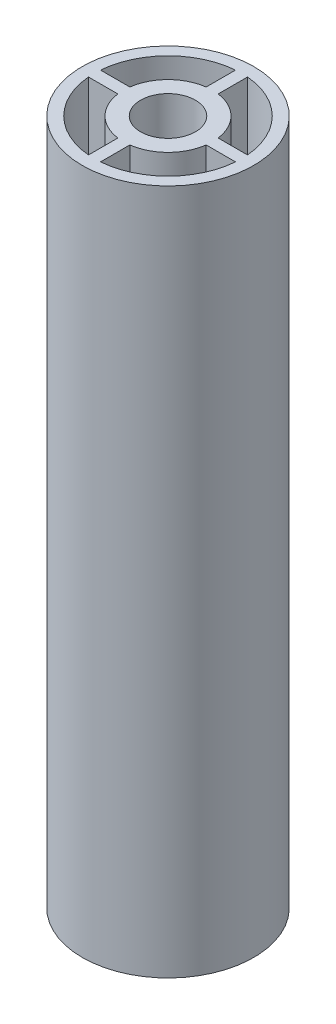
ISO-10303-21;
HEADER;
FILE_DESCRIPTION(('STEP AP214'),'2;1');
FILE_NAME('part.step','',(''),(''),'','','');
FILE_SCHEMA(('AUTOMOTIVE_DESIGN { 1 0 10303 214 1 1 1 1 }'));
ENDSEC;
DATA;
#1=APPLICATION_CONTEXT('core data for automotive mechanical design processes');
#2=APPLICATION_PROTOCOL_DEFINITION('international standard','automotive_design',2000,#1);
#3=PRODUCT_CONTEXT('',#1,'mechanical');
#4=PRODUCT('Part','Part','',(#3));
#5=PRODUCT_RELATED_PRODUCT_CATEGORY('part','',(#4));
#6=PRODUCT_DEFINITION_FORMATION('','',#4);
#7=PRODUCT_DEFINITION_CONTEXT('part definition',#1,'design');
#8=PRODUCT_DEFINITION('design','',#6,#7);
#9=PRODUCT_DEFINITION_SHAPE('','',#8);
#10=(LENGTH_UNIT() NAMED_UNIT(*) SI_UNIT(.MILLI.,.METRE.));
#11=(NAMED_UNIT(*) PLANE_ANGLE_UNIT() SI_UNIT($,.RADIAN.));
#12=(NAMED_UNIT(*) SI_UNIT($,.STERADIAN.) SOLID_ANGLE_UNIT());
#13=UNCERTAINTY_MEASURE_WITH_UNIT(LENGTH_MEASURE(1.E-05),#10,'distance_accuracy_value','');
#14=(GEOMETRIC_REPRESENTATION_CONTEXT(3) GLOBAL_UNCERTAINTY_ASSIGNED_CONTEXT((#13)) GLOBAL_UNIT_ASSIGNED_CONTEXT((#10,
#11,#12)) REPRESENTATION_CONTEXT('',''));
#15=CARTESIAN_POINT('',(0.,0.,0.));
#16=DIRECTION('',(0.,0.,1.));
#17=DIRECTION('',(1.,0.,0.));
#18=AXIS2_PLACEMENT_3D('',#15,#16,#17);
#19=CARTESIAN_POINT('',(0.,40.,0.));
#20=DIRECTION('',(0.,-1.,0.));
#21=DIRECTION('',(0.,0.,-1.));
#22=AXIS2_PLACEMENT_3D('',#19,#20,#21);
#23=CYLINDRICAL_SURFACE('',#22,4.3);
#24=CARTESIAN_POINT('',(0.,0.,0.));
#25=DIRECTION('',(0.,1.,0.));
#26=DIRECTION('',(0.,0.,1.));
#27=AXIS2_PLACEMENT_3D('',#24,#25,#26);
#28=CIRCLE('',#27,4.3);
#29=CARTESIAN_POINT('',(-0.350000000000001,0.,-4.28573214281994));
#30=VERTEX_POINT('',#29);
#31=CARTESIAN_POINT('',(-4.28573214281994,0.,-0.35));
#32=VERTEX_POINT('',#31);
#33=EDGE_CURVE('E226',#30,#32,#28,.T.);
#34=ORIENTED_EDGE('',*,*,#33,.F.);
#35=DIRECTION('',(0.,-1.,0.));
#36=VECTOR('',#35,1.);
#37=CARTESIAN_POINT('',(-0.350000000000001,40.,-4.28573214281994));
#38=LINE('',#37,#36);
#39=CARTESIAN_POINT('',(-0.350000000000001,40.,-4.28573214281994));
#40=VERTEX_POINT('',#39);
#41=EDGE_CURVE('E11',#40,#30,#38,.T.);
#42=ORIENTED_EDGE('',*,*,#41,.F.);
#43=CARTESIAN_POINT('',(0.,40.,0.));
#44=DIRECTION('',(0.,1.,0.));
#45=DIRECTION('',(0.,0.,1.));
#46=AXIS2_PLACEMENT_3D('',#43,#44,#45);
#47=CIRCLE('',#46,4.3);
#48=CARTESIAN_POINT('',(-4.28573214281994,40.,-0.35));
#49=VERTEX_POINT('',#48);
#50=EDGE_CURVE('E176',#40,#49,#47,.T.);
#51=ORIENTED_EDGE('',*,*,#50,.T.);
#52=DIRECTION('',(0.,-1.,0.));
#53=VECTOR('',#52,1.);
#54=CARTESIAN_POINT('',(-4.28573214281994,40.,-0.35));
#55=LINE('',#54,#53);
#56=EDGE_CURVE('E56',#49,#32,#55,.T.);
#57=ORIENTED_EDGE('',*,*,#56,.T.);
#58=EDGE_LOOP('',(#34,#42,#51,#57));
#59=FACE_BOUND('',#58,.T.);
#60=ADVANCED_FACE('F37',(#59),#23,.F.);
#61=CARTESIAN_POINT('',(-0.349999999999999,40.,0.));
#62=DIRECTION('',(-1.,0.,0.));
#63=DIRECTION('',(0.,0.,1.));
#64=AXIS2_PLACEMENT_3D('',#61,#62,#63);
#65=PLANE('',#64);
#66=DIRECTION('',(0.,0.,-1.));
#67=VECTOR('',#66,1.);
#68=CARTESIAN_POINT('',(-0.349999999999999,0.,0.));
#69=LINE('',#68,#67);
#70=CARTESIAN_POINT('',(-0.35,0.,-2.57633460559765));
#71=VERTEX_POINT('',#70);
#72=EDGE_CURVE('E163',#71,#30,#69,.T.);
#73=ORIENTED_EDGE('',*,*,#72,.F.);
#74=DIRECTION('',(0.,-1.,0.));
#75=VECTOR('',#74,1.);
#76=CARTESIAN_POINT('',(-0.35,40.,-2.57633460559765));
#77=LINE('',#76,#75);
#78=CARTESIAN_POINT('',(-0.35,40.,-2.57633460559765));
#79=VERTEX_POINT('',#78);
#80=EDGE_CURVE('E47',#79,#71,#77,.T.);
#81=ORIENTED_EDGE('',*,*,#80,.F.);
#82=DIRECTION('',(0.,0.,-1.));
#83=VECTOR('',#82,1.);
#84=CARTESIAN_POINT('',(-0.349999999999999,40.,0.));
#85=LINE('',#84,#83);
#86=EDGE_CURVE('E161',#79,#40,#85,.T.);
#87=ORIENTED_EDGE('',*,*,#86,.T.);
#88=ORIENTED_EDGE('',*,*,#41,.T.);
#89=EDGE_LOOP('',(#73,#81,#87,#88));
#90=FACE_BOUND('',#89,.T.);
#91=ADVANCED_FACE('F159',(#90),#65,.T.);
#92=CARTESIAN_POINT('',(0.,40.,0.));
#93=DIRECTION('',(0.,-1.,0.));
#94=DIRECTION('',(0.,0.,-1.));
#95=AXIS2_PLACEMENT_3D('',#92,#93,#94);
#96=CYLINDRICAL_SURFACE('',#95,2.6);
#97=CARTESIAN_POINT('',(0.,0.,0.));
#98=DIRECTION('',(0.,1.,0.));
#99=DIRECTION('',(0.,0.,1.));
#100=AXIS2_PLACEMENT_3D('',#97,#98,#99);
#101=CIRCLE('',#100,2.6);
#102=CARTESIAN_POINT('',(-2.57633460559765,0.,-0.35));
#103=VERTEX_POINT('',#102);
#104=EDGE_CURVE('E229',#71,#103,#101,.T.);
#105=ORIENTED_EDGE('',*,*,#104,.T.);
#106=DIRECTION('',(0.,-1.,0.));
#107=VECTOR('',#106,1.);
#108=CARTESIAN_POINT('',(-2.57633460559765,40.,-0.35));
#109=LINE('',#108,#107);
#110=CARTESIAN_POINT('',(-2.57633460559765,40.,-0.35));
#111=VERTEX_POINT('',#110);
#112=EDGE_CURVE('E106',#111,#103,#109,.T.);
#113=ORIENTED_EDGE('',*,*,#112,.F.);
#114=CARTESIAN_POINT('',(0.,40.,0.));
#115=DIRECTION('',(0.,1.,0.));
#116=DIRECTION('',(0.,0.,1.));
#117=AXIS2_PLACEMENT_3D('',#114,#115,#116);
#118=CIRCLE('',#117,2.6);
#119=EDGE_CURVE('E167',#79,#111,#118,.T.);
#120=ORIENTED_EDGE('',*,*,#119,.F.);
#121=ORIENTED_EDGE('',*,*,#80,.T.);
#122=EDGE_LOOP('',(#105,#113,#120,#121));
#123=FACE_BOUND('',#122,.T.);
#124=ADVANCED_FACE('F168',(#123),#96,.T.);
#125=CARTESIAN_POINT('',(0.,40.,0.));
#126=DIRECTION('',(0.,-1.,0.));
#127=DIRECTION('',(0.,0.,-1.));
#128=AXIS2_PLACEMENT_3D('',#125,#126,#127);
#129=CYLINDRICAL_SURFACE('',#128,4.3);
#130=CARTESIAN_POINT('',(0.,0.,0.));
#131=DIRECTION('',(0.,1.,0.));
#132=DIRECTION('',(0.,0.,1.));
#133=AXIS2_PLACEMENT_3D('',#130,#131,#132);
#134=CIRCLE('',#133,4.3);
#135=CARTESIAN_POINT('',(-4.28573214281994,0.,0.35));
#136=VERTEX_POINT('',#135);
#137=CARTESIAN_POINT('',(-0.35,0.,4.28573214281994));
#138=VERTEX_POINT('',#137);
#139=EDGE_CURVE('E214',#136,#138,#134,.T.);
#140=ORIENTED_EDGE('',*,*,#139,.F.);
#141=DIRECTION('',(0.,-1.,0.));
#142=VECTOR('',#141,1.);
#143=CARTESIAN_POINT('',(-4.28573214281994,40.,0.35));
#144=LINE('',#143,#142);
#145=CARTESIAN_POINT('',(-4.28573214281994,40.,0.35));
#146=VERTEX_POINT('',#145);
#147=EDGE_CURVE('E242',#146,#136,#144,.T.);
#148=ORIENTED_EDGE('',*,*,#147,.F.);
#149=CARTESIAN_POINT('',(0.,40.,0.));
#150=DIRECTION('',(0.,1.,0.));
#151=DIRECTION('',(0.,0.,1.));
#152=AXIS2_PLACEMENT_3D('',#149,#150,#151);
#153=CIRCLE('',#152,4.3);
#154=CARTESIAN_POINT('',(-0.35,40.,4.28573214281994));
#155=VERTEX_POINT('',#154);
#156=EDGE_CURVE('E299',#146,#155,#153,.T.);
#157=ORIENTED_EDGE('',*,*,#156,.T.);
#158=DIRECTION('',(0.,-1.,0.));
#159=VECTOR('',#158,1.);
#160=CARTESIAN_POINT('',(-0.35,40.,4.28573214281994));
#161=LINE('',#160,#159);
#162=EDGE_CURVE('E244',#155,#138,#161,.T.);
#163=ORIENTED_EDGE('',*,*,#162,.T.);
#164=EDGE_LOOP('',(#140,#148,#157,#163));
#165=FACE_BOUND('',#164,.T.);
#166=ADVANCED_FACE('F324',(#165),#129,.F.);
#167=CARTESIAN_POINT('',(0.,40.,0.349999999999999));
#168=DIRECTION('',(0.,0.,1.));
#169=DIRECTION('',(1.,0.,0.));
#170=AXIS2_PLACEMENT_3D('',#167,#168,#169);
#171=PLANE('',#170);
#172=DIRECTION('',(-1.,0.,0.));
#173=VECTOR('',#172,1.);
#174=CARTESIAN_POINT('',(0.,0.,0.349999999999999));
#175=LINE('',#174,#173);
#176=CARTESIAN_POINT('',(-2.57633460559765,0.,0.35));
#177=VERTEX_POINT('',#176);
#178=EDGE_CURVE('E217',#177,#136,#175,.T.);
#179=ORIENTED_EDGE('',*,*,#178,.F.);
#180=DIRECTION('',(0.,-1.,0.));
#181=VECTOR('',#180,1.);
#182=CARTESIAN_POINT('',(-2.57633460559765,40.,0.35));
#183=LINE('',#182,#181);
#184=CARTESIAN_POINT('',(-2.57633460559765,40.,0.35));
#185=VERTEX_POINT('',#184);
#186=EDGE_CURVE('E249',#185,#177,#183,.T.);
#187=ORIENTED_EDGE('',*,*,#186,.F.);
#188=DIRECTION('',(-1.,0.,0.));
#189=VECTOR('',#188,1.);
#190=CARTESIAN_POINT('',(0.,40.,0.349999999999999));
#191=LINE('',#190,#189);
#192=EDGE_CURVE('E302',#185,#146,#191,.T.);
#193=ORIENTED_EDGE('',*,*,#192,.T.);
#194=ORIENTED_EDGE('',*,*,#147,.T.);
#195=EDGE_LOOP('',(#179,#187,#193,#194));
#196=FACE_BOUND('',#195,.T.);
#197=ADVANCED_FACE('F326',(#196),#171,.T.);
#198=CARTESIAN_POINT('',(0.,40.,0.));
#199=DIRECTION('',(0.,-1.,0.));
#200=DIRECTION('',(0.,0.,-1.));
#201=AXIS2_PLACEMENT_3D('',#198,#199,#200);
#202=CYLINDRICAL_SURFACE('',#201,2.6);
#203=CARTESIAN_POINT('',(0.,0.,0.));
#204=DIRECTION('',(0.,1.,0.));
#205=DIRECTION('',(0.,0.,1.));
#206=AXIS2_PLACEMENT_3D('',#203,#204,#205);
#207=CIRCLE('',#206,2.6);
#208=CARTESIAN_POINT('',(-0.349999999999999,0.,2.57633460559765));
#209=VERTEX_POINT('',#208);
#210=EDGE_CURVE('E220',#177,#209,#207,.T.);
#211=ORIENTED_EDGE('',*,*,#210,.T.);
#212=DIRECTION('',(0.,-1.,0.));
#213=VECTOR('',#212,1.);
#214=CARTESIAN_POINT('',(-0.349999999999999,40.,2.57633460559765));
#215=LINE('',#214,#213);
#216=CARTESIAN_POINT('',(-0.349999999999999,40.,2.57633460559765));
#217=VERTEX_POINT('',#216);
#218=EDGE_CURVE('E246',#217,#209,#215,.T.);
#219=ORIENTED_EDGE('',*,*,#218,.F.);
#220=CARTESIAN_POINT('',(0.,40.,0.));
#221=DIRECTION('',(0.,1.,0.));
#222=DIRECTION('',(0.,0.,1.));
#223=AXIS2_PLACEMENT_3D('',#220,#221,#222);
#224=CIRCLE('',#223,2.6);
#225=EDGE_CURVE('E305',#185,#217,#224,.T.);
#226=ORIENTED_EDGE('',*,*,#225,.F.);
#227=ORIENTED_EDGE('',*,*,#186,.T.);
#228=EDGE_LOOP('',(#211,#219,#226,#227));
#229=FACE_BOUND('',#228,.T.);
#230=ADVANCED_FACE('F317',(#229),#202,.T.);
#231=CARTESIAN_POINT('',(0.,40.,0.));
#232=DIRECTION('',(0.,-1.,0.));
#233=DIRECTION('',(0.,0.,-1.));
#234=AXIS2_PLACEMENT_3D('',#231,#232,#233);
#235=CYLINDRICAL_SURFACE('',#234,4.3);
#236=CARTESIAN_POINT('',(0.,0.,0.));
#237=DIRECTION('',(0.,1.,0.));
#238=DIRECTION('',(0.,0.,1.));
#239=AXIS2_PLACEMENT_3D('',#236,#237,#238);
#240=CIRCLE('',#239,4.3);
#241=CARTESIAN_POINT('',(0.35,0.,4.28573214281994));
#242=VERTEX_POINT('',#241);
#243=CARTESIAN_POINT('',(4.28573214281994,0.,0.35));
#244=VERTEX_POINT('',#243);
#245=EDGE_CURVE('E202',#242,#244,#240,.T.);
#246=ORIENTED_EDGE('',*,*,#245,.F.);
#247=DIRECTION('',(0.,-1.,0.));
#248=VECTOR('',#247,1.);
#249=CARTESIAN_POINT('',(0.35,40.,4.28573214281994));
#250=LINE('',#249,#248);
#251=CARTESIAN_POINT('',(0.35,40.,4.28573214281994));
#252=VERTEX_POINT('',#251);
#253=EDGE_CURVE('E247',#252,#242,#250,.T.);
#254=ORIENTED_EDGE('',*,*,#253,.F.);
#255=CARTESIAN_POINT('',(0.,40.,0.));
#256=DIRECTION('',(0.,1.,0.));
#257=DIRECTION('',(0.,0.,1.));
#258=AXIS2_PLACEMENT_3D('',#255,#256,#257);
#259=CIRCLE('',#258,4.3);
#260=CARTESIAN_POINT('',(4.28573214281994,40.,0.35));
#261=VERTEX_POINT('',#260);
#262=EDGE_CURVE('E284',#252,#261,#259,.T.);
#263=ORIENTED_EDGE('',*,*,#262,.T.);
#264=DIRECTION('',(0.,-1.,0.));
#265=VECTOR('',#264,1.);
#266=CARTESIAN_POINT('',(4.28573214281994,40.,0.35));
#267=LINE('',#266,#265);
#268=EDGE_CURVE('E252',#261,#244,#267,.T.);
#269=ORIENTED_EDGE('',*,*,#268,.T.);
#270=EDGE_LOOP('',(#246,#254,#263,#269));
#271=FACE_BOUND('',#270,.T.);
#272=ADVANCED_FACE('F333',(#271),#235,.F.);
#273=CARTESIAN_POINT('',(0.349999999999999,40.,0.));
#274=DIRECTION('',(1.,0.,0.));
#275=DIRECTION('',(0.,0.,-1.));
#276=AXIS2_PLACEMENT_3D('',#273,#274,#275);
#277=PLANE('',#276);
#278=DIRECTION('',(0.,0.,1.));
#279=VECTOR('',#278,1.);
#280=CARTESIAN_POINT('',(0.349999999999999,0.,0.));
#281=LINE('',#280,#279);
#282=CARTESIAN_POINT('',(0.35,0.,2.57633460559765));
#283=VERTEX_POINT('',#282);
#284=EDGE_CURVE('E205',#283,#242,#281,.T.);
#285=ORIENTED_EDGE('',*,*,#284,.F.);
#286=DIRECTION('',(0.,-1.,0.));
#287=VECTOR('',#286,1.);
#288=CARTESIAN_POINT('',(0.35,40.,2.57633460559765));
#289=LINE('',#288,#287);
#290=CARTESIAN_POINT('',(0.35,40.,2.57633460559765));
#291=VERTEX_POINT('',#290);
#292=EDGE_CURVE('E256',#291,#283,#289,.T.);
#293=ORIENTED_EDGE('',*,*,#292,.F.);
#294=DIRECTION('',(0.,0.,1.));
#295=VECTOR('',#294,1.);
#296=CARTESIAN_POINT('',(0.349999999999999,40.,0.));
#297=LINE('',#296,#295);
#298=EDGE_CURVE('E287',#291,#252,#297,.T.);
#299=ORIENTED_EDGE('',*,*,#298,.T.);
#300=ORIENTED_EDGE('',*,*,#253,.T.);
#301=EDGE_LOOP('',(#285,#293,#299,#300));
#302=FACE_BOUND('',#301,.T.);
#303=ADVANCED_FACE('F389',(#302),#277,.T.);
#304=CARTESIAN_POINT('',(0.,40.,0.));
#305=DIRECTION('',(0.,-1.,0.));
#306=DIRECTION('',(0.,0.,-1.));
#307=AXIS2_PLACEMENT_3D('',#304,#305,#306);
#308=CYLINDRICAL_SURFACE('',#307,2.6);
#309=CARTESIAN_POINT('',(0.,0.,0.));
#310=DIRECTION('',(0.,1.,0.));
#311=DIRECTION('',(0.,0.,1.));
#312=AXIS2_PLACEMENT_3D('',#309,#310,#311);
#313=CIRCLE('',#312,2.6);
#314=CARTESIAN_POINT('',(2.57633460559765,0.,0.35));
#315=VERTEX_POINT('',#314);
#316=EDGE_CURVE('E208',#283,#315,#313,.T.);
#317=ORIENTED_EDGE('',*,*,#316,.T.);
#318=DIRECTION('',(0.,-1.,0.));
#319=VECTOR('',#318,1.);
#320=CARTESIAN_POINT('',(2.57633460559765,40.,0.35));
#321=LINE('',#320,#319);
#322=CARTESIAN_POINT('',(2.57633460559765,40.,0.35));
#323=VERTEX_POINT('',#322);
#324=EDGE_CURVE('E254',#323,#315,#321,.T.);
#325=ORIENTED_EDGE('',*,*,#324,.F.);
#326=CARTESIAN_POINT('',(0.,40.,0.));
#327=DIRECTION('',(0.,1.,0.));
#328=DIRECTION('',(0.,0.,1.));
#329=AXIS2_PLACEMENT_3D('',#326,#327,#328);
#330=CIRCLE('',#329,2.6);
#331=EDGE_CURVE('E294',#291,#323,#330,.T.);
#332=ORIENTED_EDGE('',*,*,#331,.F.);
#333=ORIENTED_EDGE('',*,*,#292,.T.);
#334=EDGE_LOOP('',(#317,#325,#332,#333));
#335=FACE_BOUND('',#334,.T.);
#336=ADVANCED_FACE('F399',(#335),#308,.T.);
#337=CARTESIAN_POINT('',(0.,40.,0.));
#338=DIRECTION('',(0.,-1.,0.));
#339=DIRECTION('',(0.,0.,-1.));
#340=AXIS2_PLACEMENT_3D('',#337,#338,#339);
#341=CYLINDRICAL_SURFACE('',#340,4.3);
#342=CARTESIAN_POINT('',(0.,0.,0.));
#343=DIRECTION('',(0.,1.,0.));
#344=DIRECTION('',(0.,0.,1.));
#345=AXIS2_PLACEMENT_3D('',#342,#343,#344);
#346=CIRCLE('',#345,4.3);
#347=CARTESIAN_POINT('',(4.28573214281994,0.,-0.35));
#348=VERTEX_POINT('',#347);
#349=CARTESIAN_POINT('',(0.349999999999999,0.,-4.28573214281994));
#350=VERTEX_POINT('',#349);
#351=EDGE_CURVE('E190',#348,#350,#346,.T.);
#352=ORIENTED_EDGE('',*,*,#351,.F.);
#353=DIRECTION('',(0.,-1.,0.));
#354=VECTOR('',#353,1.);
#355=CARTESIAN_POINT('',(4.28573214281994,40.,-0.35));
#356=LINE('',#355,#354);
#357=CARTESIAN_POINT('',(4.28573214281994,40.,-0.35));
#358=VERTEX_POINT('',#357);
#359=EDGE_CURVE('E41',#358,#348,#356,.T.);
#360=ORIENTED_EDGE('',*,*,#359,.F.);
#361=CARTESIAN_POINT('',(0.,40.,0.));
#362=DIRECTION('',(0.,1.,0.));
#363=DIRECTION('',(0.,0.,1.));
#364=AXIS2_PLACEMENT_3D('',#361,#362,#363);
#365=CIRCLE('',#364,4.3);
#366=CARTESIAN_POINT('',(0.349999999999999,40.,-4.28573214281994));
#367=VERTEX_POINT('',#366);
#368=EDGE_CURVE('E240',#358,#367,#365,.T.);
#369=ORIENTED_EDGE('',*,*,#368,.T.);
#370=DIRECTION('',(0.,-1.,0.));
#371=VECTOR('',#370,1.);
#372=CARTESIAN_POINT('',(0.349999999999999,40.,-4.28573214281994));
#373=LINE('',#372,#371);
#374=EDGE_CURVE('E189',#367,#350,#373,.T.);
#375=ORIENTED_EDGE('',*,*,#374,.T.);
#376=EDGE_LOOP('',(#352,#360,#369,#375));
#377=FACE_BOUND('',#376,.T.);
#378=ADVANCED_FACE('F39',(#377),#341,.F.);
#379=CARTESIAN_POINT('',(0.,40.,-0.349999999999999));
#380=DIRECTION('',(0.,0.,-1.));
#381=DIRECTION('',(-1.,0.,0.));
#382=AXIS2_PLACEMENT_3D('',#379,#380,#381);
#383=PLANE('',#382);
#384=DIRECTION('',(1.,0.,0.));
#385=VECTOR('',#384,1.);
#386=CARTESIAN_POINT('',(0.,0.,-0.349999999999999));
#387=LINE('',#386,#385);
#388=CARTESIAN_POINT('',(2.57633460559765,0.,-0.35));
#389=VERTEX_POINT('',#388);
#390=EDGE_CURVE('E193',#389,#348,#387,.T.);
#391=ORIENTED_EDGE('',*,*,#390,.F.);
#392=DIRECTION('',(0.,-1.,0.));
#393=VECTOR('',#392,1.);
#394=CARTESIAN_POINT('',(2.57633460559765,40.,-0.35));
#395=LINE('',#394,#393);
#396=CARTESIAN_POINT('',(2.57633460559765,40.,-0.35));
#397=VERTEX_POINT('',#396);
#398=EDGE_CURVE('E261',#397,#389,#395,.T.);
#399=ORIENTED_EDGE('',*,*,#398,.F.);
#400=DIRECTION('',(1.,0.,0.));
#401=VECTOR('',#400,1.);
#402=CARTESIAN_POINT('',(0.,40.,-0.349999999999999));
#403=LINE('',#402,#401);
#404=EDGE_CURVE('E270',#397,#358,#403,.T.);
#405=ORIENTED_EDGE('',*,*,#404,.T.);
#406=ORIENTED_EDGE('',*,*,#359,.T.);
#407=EDGE_LOOP('',(#391,#399,#405,#406));
#408=FACE_BOUND('',#407,.T.);
#409=ADVANCED_FACE('F268',(#408),#383,.T.);
#410=CARTESIAN_POINT('',(0.,40.,0.));
#411=DIRECTION('',(0.,-1.,0.));
#412=DIRECTION('',(0.,0.,-1.));
#413=AXIS2_PLACEMENT_3D('',#410,#411,#412);
#414=CYLINDRICAL_SURFACE('',#413,2.6);
#415=CARTESIAN_POINT('',(0.,0.,0.));
#416=DIRECTION('',(0.,1.,0.));
#417=DIRECTION('',(0.,0.,1.));
#418=AXIS2_PLACEMENT_3D('',#415,#416,#417);
#419=CIRCLE('',#418,2.6);
#420=CARTESIAN_POINT('',(0.349999999999999,0.,-2.57633460559765));
#421=VERTEX_POINT('',#420);
#422=EDGE_CURVE('E196',#389,#421,#419,.T.);
#423=ORIENTED_EDGE('',*,*,#422,.T.);
#424=DIRECTION('',(0.,-1.,0.));
#425=VECTOR('',#424,1.);
#426=CARTESIAN_POINT('',(0.349999999999999,40.,-2.57633460559765));
#427=LINE('',#426,#425);
#428=CARTESIAN_POINT('',(0.349999999999999,40.,-2.57633460559765));
#429=VERTEX_POINT('',#428);
#430=EDGE_CURVE('E260',#429,#421,#427,.T.);
#431=ORIENTED_EDGE('',*,*,#430,.F.);
#432=CARTESIAN_POINT('',(0.,40.,0.));
#433=DIRECTION('',(0.,1.,0.));
#434=DIRECTION('',(0.,0.,1.));
#435=AXIS2_PLACEMENT_3D('',#432,#433,#434);
#436=CIRCLE('',#435,2.6);
#437=EDGE_CURVE('E278',#397,#429,#436,.T.);
#438=ORIENTED_EDGE('',*,*,#437,.F.);
#439=ORIENTED_EDGE('',*,*,#398,.T.);
#440=EDGE_LOOP('',(#423,#431,#438,#439));
#441=FACE_BOUND('',#440,.T.);
#442=ADVANCED_FACE('F276',(#441),#414,.T.);
#443=CARTESIAN_POINT('',(0.,40.,0.));
#444=DIRECTION('',(0.,-1.,0.));
#445=DIRECTION('',(0.,0.,-1.));
#446=AXIS2_PLACEMENT_3D('',#443,#444,#445);
#447=CYLINDRICAL_SURFACE('',#446,1.6);
#448=CARTESIAN_POINT('',(0.,40.,0.));
#449=DIRECTION('',(0.,1.,0.));
#450=DIRECTION('',(0.,0.,1.));
#451=AXIS2_PLACEMENT_3D('',#448,#449,#450);
#452=CIRCLE('',#451,1.6);
#453=CARTESIAN_POINT('',(0.,40.,1.6));
#454=VERTEX_POINT('',#453);
#455=EDGE_CURVE('E183',#454,#454,#452,.T.);
#456=ORIENTED_EDGE('',*,*,#455,.T.);
#457=EDGE_LOOP('',(#456));
#458=FACE_BOUND('',#457,.T.);
#459=CARTESIAN_POINT('',(0.,0.,0.));
#460=DIRECTION('',(0.,1.,0.));
#461=DIRECTION('',(0.,0.,1.));
#462=AXIS2_PLACEMENT_3D('',#459,#460,#461);
#463=CIRCLE('',#462,1.6);
#464=CARTESIAN_POINT('',(0.,0.,1.6));
#465=VERTEX_POINT('',#464);
#466=EDGE_CURVE('E234',#465,#465,#463,.T.);
#467=ORIENTED_EDGE('',*,*,#466,.F.);
#468=EDGE_LOOP('',(#467));
#469=FACE_BOUND('',#468,.T.);
#470=ADVANCED_FACE('F353',(#458,#469),#447,.F.);
#471=CARTESIAN_POINT('',(0.,40.,-0.350000000000001));
#472=DIRECTION('',(0.,0.,-1.));
#473=DIRECTION('',(-1.,0.,0.));
#474=AXIS2_PLACEMENT_3D('',#471,#472,#473);
#475=PLANE('',#474);
#476=DIRECTION('',(1.,0.,0.));
#477=VECTOR('',#476,1.);
#478=CARTESIAN_POINT('',(0.,0.,-0.350000000000001));
#479=LINE('',#478,#477);
#480=EDGE_CURVE('E231',#32,#103,#479,.T.);
#481=ORIENTED_EDGE('',*,*,#480,.F.);
#482=ORIENTED_EDGE('',*,*,#56,.F.);
#483=DIRECTION('',(1.,0.,0.));
#484=VECTOR('',#483,1.);
#485=CARTESIAN_POINT('',(0.,40.,-0.350000000000001));
#486=LINE('',#485,#484);
#487=EDGE_CURVE('E171',#49,#111,#486,.T.);
#488=ORIENTED_EDGE('',*,*,#487,.T.);
#489=ORIENTED_EDGE('',*,*,#112,.T.);
#490=EDGE_LOOP('',(#481,#482,#488,#489));
#491=FACE_BOUND('',#490,.T.);
#492=ADVANCED_FACE('F346',(#491),#475,.T.);
#493=CARTESIAN_POINT('',(-0.349999999999999,40.,0.));
#494=DIRECTION('',(-1.,0.,0.));
#495=DIRECTION('',(0.,0.,1.));
#496=AXIS2_PLACEMENT_3D('',#493,#494,#495);
#497=PLANE('',#496);
#498=DIRECTION('',(0.,0.,-1.));
#499=VECTOR('',#498,1.);
#500=CARTESIAN_POINT('',(-0.349999999999999,0.,0.));
#501=LINE('',#500,#499);
#502=EDGE_CURVE('E223',#138,#209,#501,.T.);
#503=ORIENTED_EDGE('',*,*,#502,.F.);
#504=ORIENTED_EDGE('',*,*,#162,.F.);
#505=DIRECTION('',(0.,0.,-1.));
#506=VECTOR('',#505,1.);
#507=CARTESIAN_POINT('',(-0.349999999999999,40.,0.));
#508=LINE('',#507,#506);
#509=EDGE_CURVE('E178',#155,#217,#508,.T.);
#510=ORIENTED_EDGE('',*,*,#509,.T.);
#511=ORIENTED_EDGE('',*,*,#218,.T.);
#512=EDGE_LOOP('',(#503,#504,#510,#511));
#513=FACE_BOUND('',#512,.T.);
#514=ADVANCED_FACE('F310',(#513),#497,.T.);
#515=CARTESIAN_POINT('',(0.,40.,0.349999999999999));
#516=DIRECTION('',(0.,0.,1.));
#517=DIRECTION('',(1.,0.,0.));
#518=AXIS2_PLACEMENT_3D('',#515,#516,#517);
#519=PLANE('',#518);
#520=DIRECTION('',(-1.,0.,0.));
#521=VECTOR('',#520,1.);
#522=CARTESIAN_POINT('',(0.,0.,0.349999999999999));
#523=LINE('',#522,#521);
#524=EDGE_CURVE('E211',#244,#315,#523,.T.);
#525=ORIENTED_EDGE('',*,*,#524,.F.);
#526=ORIENTED_EDGE('',*,*,#268,.F.);
#527=DIRECTION('',(-1.,0.,0.));
#528=VECTOR('',#527,1.);
#529=CARTESIAN_POINT('',(0.,40.,0.349999999999999));
#530=LINE('',#529,#528);
#531=EDGE_CURVE('E296',#261,#323,#530,.T.);
#532=ORIENTED_EDGE('',*,*,#531,.T.);
#533=ORIENTED_EDGE('',*,*,#324,.T.);
#534=EDGE_LOOP('',(#525,#526,#532,#533));
#535=FACE_BOUND('',#534,.T.);
#536=ADVANCED_FACE('F345',(#535),#519,.T.);
#537=CARTESIAN_POINT('',(0.349999999999999,40.,0.));
#538=DIRECTION('',(1.,0.,0.));
#539=DIRECTION('',(0.,0.,-1.));
#540=AXIS2_PLACEMENT_3D('',#537,#538,#539);
#541=PLANE('',#540);
#542=DIRECTION('',(0.,0.,1.));
#543=VECTOR('',#542,1.);
#544=CARTESIAN_POINT('',(0.349999999999999,0.,0.));
#545=LINE('',#544,#543);
#546=EDGE_CURVE('E199',#350,#421,#545,.T.);
#547=ORIENTED_EDGE('',*,*,#546,.F.);
#548=ORIENTED_EDGE('',*,*,#374,.F.);
#549=DIRECTION('',(0.,0.,1.));
#550=VECTOR('',#549,1.);
#551=CARTESIAN_POINT('',(0.349999999999999,40.,0.));
#552=LINE('',#551,#550);
#553=EDGE_CURVE('E281',#367,#429,#552,.T.);
#554=ORIENTED_EDGE('',*,*,#553,.T.);
#555=ORIENTED_EDGE('',*,*,#430,.T.);
#556=EDGE_LOOP('',(#547,#548,#554,#555));
#557=FACE_BOUND('',#556,.T.);
#558=ADVANCED_FACE('F282',(#557),#541,.T.);
#559=CARTESIAN_POINT('',(0.,40.,0.));
#560=DIRECTION('',(0.,-1.,0.));
#561=DIRECTION('',(0.,0.,-1.));
#562=AXIS2_PLACEMENT_3D('',#559,#560,#561);
#563=CYLINDRICAL_SURFACE('',#562,5.);
#564=CARTESIAN_POINT('',(0.,40.,0.));
#565=DIRECTION('',(0.,1.,0.));
#566=DIRECTION('',(0.,0.,1.));
#567=AXIS2_PLACEMENT_3D('',#564,#565,#566);
#568=CIRCLE('',#567,5.);
#569=CARTESIAN_POINT('',(0.,40.,5.));
#570=VERTEX_POINT('',#569);
#571=EDGE_CURVE('E186',#570,#570,#568,.T.);
#572=ORIENTED_EDGE('',*,*,#571,.F.);
#573=EDGE_LOOP('',(#572));
#574=FACE_BOUND('',#573,.T.);
#575=CARTESIAN_POINT('',(0.,0.,0.));
#576=DIRECTION('',(0.,1.,0.));
#577=DIRECTION('',(0.,0.,1.));
#578=AXIS2_PLACEMENT_3D('',#575,#576,#577);
#579=CIRCLE('',#578,5.);
#580=CARTESIAN_POINT('',(0.,0.,5.));
#581=VERTEX_POINT('',#580);
#582=EDGE_CURVE('E237',#581,#581,#579,.T.);
#583=ORIENTED_EDGE('',*,*,#582,.T.);
#584=EDGE_LOOP('',(#583));
#585=FACE_BOUND('',#584,.T.);
#586=ADVANCED_FACE('F460',(#574,#585),#563,.T.);
#587=CARTESIAN_POINT('',(0.,40.,0.));
#588=DIRECTION('',(0.,1.,0.));
#589=DIRECTION('',(0.,0.,1.));
#590=AXIS2_PLACEMENT_3D('',#587,#588,#589);
#591=PLANE('',#590);
#592=ORIENTED_EDGE('',*,*,#368,.F.);
#593=ORIENTED_EDGE('',*,*,#404,.F.);
#594=ORIENTED_EDGE('',*,*,#437,.T.);
#595=ORIENTED_EDGE('',*,*,#553,.F.);
#596=EDGE_LOOP('',(#592,#593,#594,#595));
#597=FACE_BOUND('',#596,.T.);
#598=ORIENTED_EDGE('',*,*,#262,.F.);
#599=ORIENTED_EDGE('',*,*,#298,.F.);
#600=ORIENTED_EDGE('',*,*,#331,.T.);
#601=ORIENTED_EDGE('',*,*,#531,.F.);
#602=EDGE_LOOP('',(#598,#599,#600,#601));
#603=FACE_BOUND('',#602,.T.);
#604=ORIENTED_EDGE('',*,*,#156,.F.);
#605=ORIENTED_EDGE('',*,*,#192,.F.);
#606=ORIENTED_EDGE('',*,*,#225,.T.);
#607=ORIENTED_EDGE('',*,*,#509,.F.);
#608=EDGE_LOOP('',(#604,#605,#606,#607));
#609=FACE_BOUND('',#608,.T.);
#610=ORIENTED_EDGE('',*,*,#50,.F.);
#611=ORIENTED_EDGE('',*,*,#86,.F.);
#612=ORIENTED_EDGE('',*,*,#119,.T.);
#613=ORIENTED_EDGE('',*,*,#487,.F.);
#614=EDGE_LOOP('',(#610,#611,#612,#613));
#615=FACE_BOUND('',#614,.T.);
#616=ORIENTED_EDGE('',*,*,#455,.F.);
#617=EDGE_LOOP('',(#616));
#618=FACE_BOUND('',#617,.T.);
#619=ORIENTED_EDGE('',*,*,#571,.T.);
#620=EDGE_LOOP('',(#619));
#621=FACE_BOUND('',#620,.T.);
#622=ADVANCED_FACE('F174',(#597,#603,#609,#615,#618,#621),#591,.T.);
#623=CARTESIAN_POINT('',(0.,0.,0.));
#624=DIRECTION('',(0.,1.,0.));
#625=DIRECTION('',(0.,0.,1.));
#626=AXIS2_PLACEMENT_3D('',#623,#624,#625);
#627=PLANE('',#626);
#628=ORIENTED_EDGE('',*,*,#351,.T.);
#629=ORIENTED_EDGE('',*,*,#546,.T.);
#630=ORIENTED_EDGE('',*,*,#422,.F.);
#631=ORIENTED_EDGE('',*,*,#390,.T.);
#632=EDGE_LOOP('',(#628,#629,#630,#631));
#633=FACE_BOUND('',#632,.T.);
#634=ORIENTED_EDGE('',*,*,#245,.T.);
#635=ORIENTED_EDGE('',*,*,#524,.T.);
#636=ORIENTED_EDGE('',*,*,#316,.F.);
#637=ORIENTED_EDGE('',*,*,#284,.T.);
#638=EDGE_LOOP('',(#634,#635,#636,#637));
#639=FACE_BOUND('',#638,.T.);
#640=ORIENTED_EDGE('',*,*,#139,.T.);
#641=ORIENTED_EDGE('',*,*,#502,.T.);
#642=ORIENTED_EDGE('',*,*,#210,.F.);
#643=ORIENTED_EDGE('',*,*,#178,.T.);
#644=EDGE_LOOP('',(#640,#641,#642,#643));
#645=FACE_BOUND('',#644,.T.);
#646=ORIENTED_EDGE('',*,*,#33,.T.);
#647=ORIENTED_EDGE('',*,*,#480,.T.);
#648=ORIENTED_EDGE('',*,*,#104,.F.);
#649=ORIENTED_EDGE('',*,*,#72,.T.);
#650=EDGE_LOOP('',(#646,#647,#648,#649));
#651=FACE_BOUND('',#650,.T.);
#652=ORIENTED_EDGE('',*,*,#466,.T.);
#653=EDGE_LOOP('',(#652));
#654=FACE_BOUND('',#653,.T.);
#655=ORIENTED_EDGE('',*,*,#582,.F.);
#656=EDGE_LOOP('',(#655));
#657=FACE_BOUND('',#656,.T.);
#658=ADVANCED_FACE('F273',(#633,#639,#645,#651,#654,#657),#627,.F.);
#659=CLOSED_SHELL('',(#60,#91,#124,#166,#197,#230,#272,#303,#336,#378,#409,#442,#470,#492,#514,
#536,#558,#586,#622,#658));
#660=MANIFOLD_SOLID_BREP('B2',#659);
#661=ADVANCED_BREP_SHAPE_REPRESENTATION('',(#18,#660),#14);
#662=SHAPE_DEFINITION_REPRESENTATION(#9,#661);
ENDSEC;
END-ISO-10303-21;
